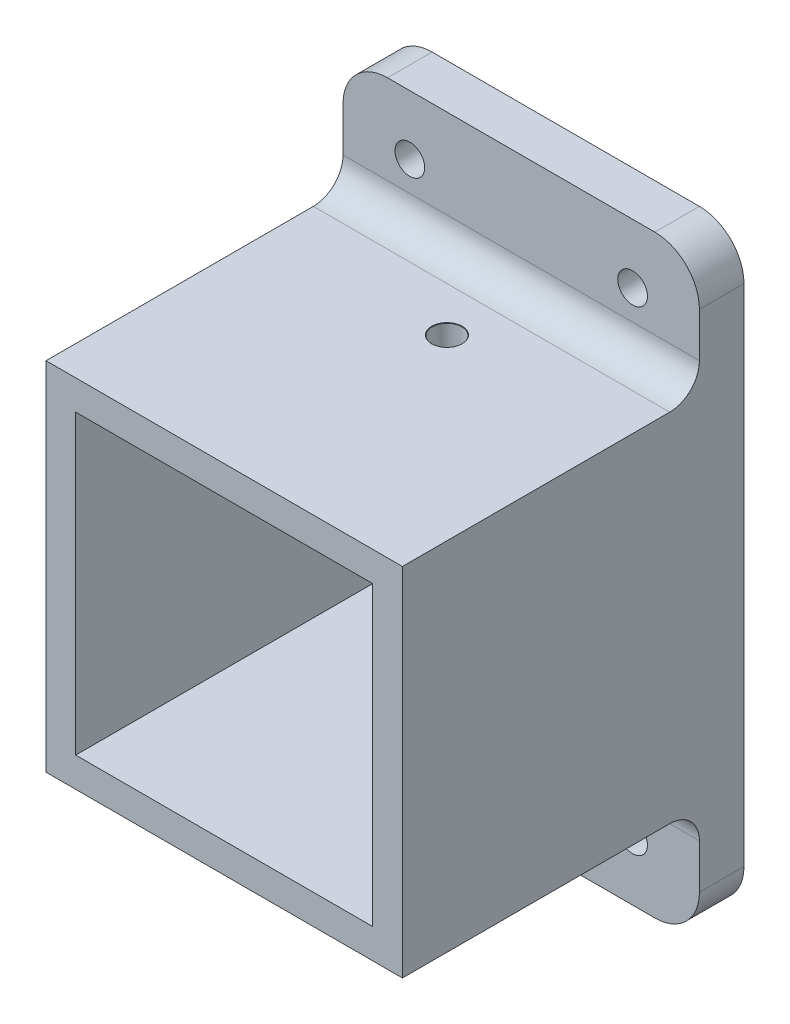
ISO-10303-21;
HEADER;
FILE_DESCRIPTION(('STEP AP214'),'2;1');
FILE_NAME('part.step','',(''),(''),'','','');
FILE_SCHEMA(('AUTOMOTIVE_DESIGN { 1 0 10303 214 1 1 1 1 }'));
ENDSEC;
DATA;
#1=APPLICATION_CONTEXT('core data for automotive mechanical design processes');
#2=APPLICATION_PROTOCOL_DEFINITION('international standard','automotive_design',2000,#1);
#3=PRODUCT_CONTEXT('',#1,'mechanical');
#4=PRODUCT('Part','Part','',(#3));
#5=PRODUCT_RELATED_PRODUCT_CATEGORY('part','',(#4));
#6=PRODUCT_DEFINITION_FORMATION('','',#4);
#7=PRODUCT_DEFINITION_CONTEXT('part definition',#1,'design');
#8=PRODUCT_DEFINITION('design','',#6,#7);
#9=PRODUCT_DEFINITION_SHAPE('','',#8);
#10=(LENGTH_UNIT() NAMED_UNIT(*) SI_UNIT(.MILLI.,.METRE.));
#11=(NAMED_UNIT(*) PLANE_ANGLE_UNIT() SI_UNIT($,.RADIAN.));
#12=(NAMED_UNIT(*) SI_UNIT($,.STERADIAN.) SOLID_ANGLE_UNIT());
#13=UNCERTAINTY_MEASURE_WITH_UNIT(LENGTH_MEASURE(1.E-05),#10,'distance_accuracy_value','');
#14=(GEOMETRIC_REPRESENTATION_CONTEXT(3) GLOBAL_UNCERTAINTY_ASSIGNED_CONTEXT((#13)) GLOBAL_UNIT_ASSIGNED_CONTEXT((#10,
#11,#12)) REPRESENTATION_CONTEXT('',''));
#15=CARTESIAN_POINT('',(0.,0.,0.));
#16=DIRECTION('',(0.,0.,1.));
#17=DIRECTION('',(1.,0.,0.));
#18=AXIS2_PLACEMENT_3D('',#15,#16,#17);
#19=CARTESIAN_POINT('',(0.,0.,20.));
#20=DIRECTION('',(0.,0.,1.));
#21=DIRECTION('',(1.,0.,0.));
#22=AXIS2_PLACEMENT_3D('',#19,#20,#21);
#23=PLANE('',#22);
#24=DIRECTION('',(1.,0.,0.));
#25=VECTOR('',#24,1.);
#26=CARTESIAN_POINT('',(-12.,-12.,20.));
#27=LINE('',#26,#25);
#28=CARTESIAN_POINT('',(-12.,-12.,20.));
#29=VERTEX_POINT('',#28);
#30=CARTESIAN_POINT('',(12.,-12.,20.));
#31=VERTEX_POINT('',#30);
#32=EDGE_CURVE('E204',#29,#31,#27,.T.);
#33=ORIENTED_EDGE('',*,*,#32,.T.);
#34=DIRECTION('',(0.,1.,0.));
#35=VECTOR('',#34,1.);
#36=CARTESIAN_POINT('',(12.,-12.,20.));
#37=LINE('',#36,#35);
#38=CARTESIAN_POINT('',(12.,12.,20.));
#39=VERTEX_POINT('',#38);
#40=EDGE_CURVE('E207',#31,#39,#37,.T.);
#41=ORIENTED_EDGE('',*,*,#40,.T.);
#42=DIRECTION('',(-1.,0.,0.));
#43=VECTOR('',#42,1.);
#44=CARTESIAN_POINT('',(-12.,12.,20.));
#45=LINE('',#44,#43);
#46=CARTESIAN_POINT('',(-12.,12.,20.));
#47=VERTEX_POINT('',#46);
#48=EDGE_CURVE('E206',#39,#47,#45,.T.);
#49=ORIENTED_EDGE('',*,*,#48,.T.);
#50=DIRECTION('',(0.,-1.,0.));
#51=VECTOR('',#50,1.);
#52=CARTESIAN_POINT('',(-12.,-12.,20.));
#53=LINE('',#52,#51);
#54=EDGE_CURVE('E208',#47,#29,#53,.T.);
#55=ORIENTED_EDGE('',*,*,#54,.T.);
#56=EDGE_LOOP('',(#33,#41,#49,#55));
#57=FACE_BOUND('',#56,.T.);
#58=DIRECTION('',(0.,1.,0.));
#59=VECTOR('',#58,1.);
#60=CARTESIAN_POINT('',(10.,-10.,20.));
#61=LINE('',#60,#59);
#62=CARTESIAN_POINT('',(10.,-10.,20.));
#63=VERTEX_POINT('',#62);
#64=CARTESIAN_POINT('',(10.,10.,20.));
#65=VERTEX_POINT('',#64);
#66=EDGE_CURVE('E191',#63,#65,#61,.T.);
#67=ORIENTED_EDGE('',*,*,#66,.F.);
#68=DIRECTION('',(1.,0.,0.));
#69=VECTOR('',#68,1.);
#70=CARTESIAN_POINT('',(-10.,-10.,20.));
#71=LINE('',#70,#69);
#72=CARTESIAN_POINT('',(-10.,-10.,20.));
#73=VERTEX_POINT('',#72);
#74=EDGE_CURVE('E195',#73,#63,#71,.T.);
#75=ORIENTED_EDGE('',*,*,#74,.F.);
#76=DIRECTION('',(0.,-1.,0.));
#77=VECTOR('',#76,1.);
#78=CARTESIAN_POINT('',(-10.,-10.,20.));
#79=LINE('',#78,#77);
#80=CARTESIAN_POINT('',(-10.,10.,20.));
#81=VERTEX_POINT('',#80);
#82=EDGE_CURVE('E173',#81,#73,#79,.T.);
#83=ORIENTED_EDGE('',*,*,#82,.F.);
#84=DIRECTION('',(-1.,0.,0.));
#85=VECTOR('',#84,1.);
#86=CARTESIAN_POINT('',(-10.,10.,20.));
#87=LINE('',#86,#85);
#88=EDGE_CURVE('E332',#65,#81,#87,.T.);
#89=ORIENTED_EDGE('',*,*,#88,.F.);
#90=EDGE_LOOP('',(#67,#75,#83,#89));
#91=FACE_BOUND('',#90,.T.);
#92=ADVANCED_FACE('F41',(#57,#91),#23,.T.);
#93=CARTESIAN_POINT('',(-12.,-12.,20.));
#94=DIRECTION('',(0.,1.,0.));
#95=DIRECTION('',(0.,0.,1.));
#96=AXIS2_PLACEMENT_3D('',#93,#94,#95);
#97=PLANE('',#96);
#98=CARTESIAN_POINT('',(0.,-12.,5.));
#99=DIRECTION('',(0.,1.,0.));
#100=DIRECTION('',(0.,0.,1.));
#101=AXIS2_PLACEMENT_3D('',#98,#99,#100);
#102=CIRCLE('',#101,0.999999999999991);
#103=CARTESIAN_POINT('',(0.,-12.,5.99999999999999));
#104=VERTEX_POINT('',#103);
#105=EDGE_CURVE('E250',#104,#104,#102,.T.);
#106=ORIENTED_EDGE('',*,*,#105,.T.);
#107=EDGE_LOOP('',(#106));
#108=FACE_BOUND('',#107,.T.);
#109=DIRECTION('',(0.,0.,-1.));
#110=VECTOR('',#109,1.);
#111=CARTESIAN_POINT('',(-12.,-12.,20.));
#112=LINE('',#111,#110);
#113=CARTESIAN_POINT('',(-12.,-12.,2.));
#114=VERTEX_POINT('',#113);
#115=EDGE_CURVE('E215',#29,#114,#112,.T.);
#116=ORIENTED_EDGE('',*,*,#115,.T.);
#117=DIRECTION('',(1.,0.,0.));
#118=VECTOR('',#117,1.);
#119=CARTESIAN_POINT('',(12.,-12.,2.));
#120=LINE('',#119,#118);
#121=CARTESIAN_POINT('',(12.,-12.,2.));
#122=VERTEX_POINT('',#121);
#123=EDGE_CURVE('E290',#114,#122,#120,.T.);
#124=ORIENTED_EDGE('',*,*,#123,.T.);
#125=DIRECTION('',(0.,0.,-1.));
#126=VECTOR('',#125,1.);
#127=CARTESIAN_POINT('',(12.,-12.,20.));
#128=LINE('',#127,#126);
#129=EDGE_CURVE('E221',#31,#122,#128,.T.);
#130=ORIENTED_EDGE('',*,*,#129,.F.);
#131=ORIENTED_EDGE('',*,*,#32,.F.);
#132=EDGE_LOOP('',(#116,#124,#130,#131));
#133=FACE_BOUND('',#132,.T.);
#134=ADVANCED_FACE('F341',(#108,#133),#97,.F.);
#135=CARTESIAN_POINT('',(12.,-12.,20.));
#136=DIRECTION('',(-1.,0.,0.));
#137=DIRECTION('',(0.,-1.,0.));
#138=AXIS2_PLACEMENT_3D('',#135,#136,#137);
#139=PLANE('',#138);
#140=DIRECTION('',(0.,1.,0.));
#141=VECTOR('',#140,1.);
#142=CARTESIAN_POINT('',(12.,0.,0.));
#143=LINE('',#142,#141);
#144=CARTESIAN_POINT('',(12.,-17.,0.));
#145=VERTEX_POINT('',#144);
#146=CARTESIAN_POINT('',(12.,-14.,0.));
#147=VERTEX_POINT('',#146);
#148=EDGE_CURVE('E329',#145,#147,#143,.T.);
#149=ORIENTED_EDGE('',*,*,#148,.F.);
#150=DIRECTION('',(0.,0.,1.));
#151=VECTOR('',#150,1.);
#152=CARTESIAN_POINT('',(12.,-17.,20.));
#153=LINE('',#152,#151);
#154=CARTESIAN_POINT('',(12.,-17.,-3.));
#155=VERTEX_POINT('',#154);
#156=EDGE_CURVE('E271',#145,#155,#153,.F.);
#157=ORIENTED_EDGE('',*,*,#156,.T.);
#158=DIRECTION('',(0.,1.,0.));
#159=VECTOR('',#158,1.);
#160=CARTESIAN_POINT('',(12.,0.,-3.));
#161=LINE('',#160,#159);
#162=CARTESIAN_POINT('',(12.,17.,-3.));
#163=VERTEX_POINT('',#162);
#164=EDGE_CURVE('E190',#155,#163,#161,.T.);
#165=ORIENTED_EDGE('',*,*,#164,.T.);
#166=DIRECTION('',(0.,0.,1.));
#167=VECTOR('',#166,1.);
#168=CARTESIAN_POINT('',(12.,17.,0.));
#169=LINE('',#168,#167);
#170=CARTESIAN_POINT('',(12.,17.,0.));
#171=VERTEX_POINT('',#170);
#172=EDGE_CURVE('E270',#163,#171,#169,.T.);
#173=ORIENTED_EDGE('',*,*,#172,.T.);
#174=CARTESIAN_POINT('',(12.,14.,0.));
#175=VERTEX_POINT('',#174);
#176=EDGE_CURVE('E305',#175,#171,#143,.T.);
#177=ORIENTED_EDGE('',*,*,#176,.F.);
#178=CARTESIAN_POINT('',(12.,14.,2.));
#179=DIRECTION('',(-1.,0.,0.));
#180=DIRECTION('',(0.,-1.,0.));
#181=AXIS2_PLACEMENT_3D('',#178,#179,#180);
#182=CIRCLE('',#181,2.);
#183=CARTESIAN_POINT('',(12.,12.,2.));
#184=VERTEX_POINT('',#183);
#185=EDGE_CURVE('E298',#175,#184,#182,.T.);
#186=ORIENTED_EDGE('',*,*,#185,.T.);
#187=DIRECTION('',(0.,0.,-1.));
#188=VECTOR('',#187,1.);
#189=CARTESIAN_POINT('',(12.,12.,20.));
#190=LINE('',#189,#188);
#191=EDGE_CURVE('E219',#39,#184,#190,.T.);
#192=ORIENTED_EDGE('',*,*,#191,.F.);
#193=ORIENTED_EDGE('',*,*,#40,.F.);
#194=ORIENTED_EDGE('',*,*,#129,.T.);
#195=CARTESIAN_POINT('',(12.,-14.,2.));
#196=DIRECTION('',(-1.,0.,0.));
#197=DIRECTION('',(0.,-1.,0.));
#198=AXIS2_PLACEMENT_3D('',#195,#196,#197);
#199=CIRCLE('',#198,2.);
#200=EDGE_CURVE('E47',#122,#147,#199,.T.);
#201=ORIENTED_EDGE('',*,*,#200,.T.);
#202=EDGE_LOOP('',(#149,#157,#165,#173,#177,#186,#192,#193,#194,#201));
#203=FACE_BOUND('',#202,.T.);
#204=ADVANCED_FACE('F297',(#203),#139,.F.);
#205=CARTESIAN_POINT('',(-12.,12.,20.));
#206=DIRECTION('',(0.,-1.,0.));
#207=DIRECTION('',(0.,0.,-1.));
#208=AXIS2_PLACEMENT_3D('',#205,#206,#207);
#209=PLANE('',#208);
#210=CARTESIAN_POINT('',(0.,12.,5.));
#211=DIRECTION('',(0.,1.,0.));
#212=DIRECTION('',(0.,0.,1.));
#213=AXIS2_PLACEMENT_3D('',#210,#211,#212);
#214=CIRCLE('',#213,1.025);
#215=CARTESIAN_POINT('',(0.,12.,6.025));
#216=VERTEX_POINT('',#215);
#217=EDGE_CURVE('E527',#216,#216,#214,.T.);
#218=ORIENTED_EDGE('',*,*,#217,.F.);
#219=EDGE_LOOP('',(#218));
#220=FACE_BOUND('',#219,.T.);
#221=ORIENTED_EDGE('',*,*,#191,.T.);
#222=DIRECTION('',(-1.,0.,0.));
#223=VECTOR('',#222,1.);
#224=CARTESIAN_POINT('',(-12.,12.,2.));
#225=LINE('',#224,#223);
#226=CARTESIAN_POINT('',(-12.,12.,2.));
#227=VERTEX_POINT('',#226);
#228=EDGE_CURVE('E285',#184,#227,#225,.T.);
#229=ORIENTED_EDGE('',*,*,#228,.T.);
#230=DIRECTION('',(0.,0.,-1.));
#231=VECTOR('',#230,1.);
#232=CARTESIAN_POINT('',(-12.,12.,20.));
#233=LINE('',#232,#231);
#234=EDGE_CURVE('E213',#47,#227,#233,.T.);
#235=ORIENTED_EDGE('',*,*,#234,.F.);
#236=ORIENTED_EDGE('',*,*,#48,.F.);
#237=EDGE_LOOP('',(#221,#229,#235,#236));
#238=FACE_BOUND('',#237,.T.);
#239=ADVANCED_FACE('F310',(#220,#238),#209,.F.);
#240=CARTESIAN_POINT('',(-12.,-12.,20.));
#241=DIRECTION('',(1.,0.,0.));
#242=DIRECTION('',(0.,1.,0.));
#243=AXIS2_PLACEMENT_3D('',#240,#241,#242);
#244=PLANE('',#243);
#245=DIRECTION('',(0.,1.,0.));
#246=VECTOR('',#245,1.);
#247=CARTESIAN_POINT('',(-12.,0.,-3.));
#248=LINE('',#247,#246);
#249=CARTESIAN_POINT('',(-12.,-17.,-3.));
#250=VERTEX_POINT('',#249);
#251=CARTESIAN_POINT('',(-12.,17.,-3.));
#252=VERTEX_POINT('',#251);
#253=EDGE_CURVE('E407',#250,#252,#248,.T.);
#254=ORIENTED_EDGE('',*,*,#253,.F.);
#255=DIRECTION('',(0.,0.,1.));
#256=VECTOR('',#255,1.);
#257=CARTESIAN_POINT('',(-12.,-17.,20.));
#258=LINE('',#257,#256);
#259=CARTESIAN_POINT('',(-12.,-17.,0.));
#260=VERTEX_POINT('',#259);
#261=EDGE_CURVE('E249',#250,#260,#258,.T.);
#262=ORIENTED_EDGE('',*,*,#261,.T.);
#263=DIRECTION('',(0.,1.,0.));
#264=VECTOR('',#263,1.);
#265=CARTESIAN_POINT('',(-12.,0.,0.));
#266=LINE('',#265,#264);
#267=CARTESIAN_POINT('',(-12.,-14.,0.));
#268=VERTEX_POINT('',#267);
#269=EDGE_CURVE('E318',#260,#268,#266,.T.);
#270=ORIENTED_EDGE('',*,*,#269,.T.);
#271=CARTESIAN_POINT('',(-12.,-14.,2.));
#272=DIRECTION('',(1.,0.,0.));
#273=DIRECTION('',(0.,1.,0.));
#274=AXIS2_PLACEMENT_3D('',#271,#272,#273);
#275=CIRCLE('',#274,2.);
#276=EDGE_CURVE('E11',#268,#114,#275,.T.);
#277=ORIENTED_EDGE('',*,*,#276,.T.);
#278=ORIENTED_EDGE('',*,*,#115,.F.);
#279=ORIENTED_EDGE('',*,*,#54,.F.);
#280=ORIENTED_EDGE('',*,*,#234,.T.);
#281=CARTESIAN_POINT('',(-12.,14.,2.));
#282=DIRECTION('',(1.,0.,0.));
#283=DIRECTION('',(0.,1.,0.));
#284=AXIS2_PLACEMENT_3D('',#281,#282,#283);
#285=CIRCLE('',#284,2.);
#286=CARTESIAN_POINT('',(-12.,14.,0.));
#287=VERTEX_POINT('',#286);
#288=EDGE_CURVE('E295',#227,#287,#285,.T.);
#289=ORIENTED_EDGE('',*,*,#288,.T.);
#290=CARTESIAN_POINT('',(-12.,17.,0.));
#291=VERTEX_POINT('',#290);
#292=EDGE_CURVE('E313',#287,#291,#266,.T.);
#293=ORIENTED_EDGE('',*,*,#292,.T.);
#294=DIRECTION('',(0.,0.,1.));
#295=VECTOR('',#294,1.);
#296=CARTESIAN_POINT('',(-12.,17.,-3.));
#297=LINE('',#296,#295);
#298=EDGE_CURVE('E224',#291,#252,#297,.F.);
#299=ORIENTED_EDGE('',*,*,#298,.T.);
#300=EDGE_LOOP('',(#254,#262,#270,#277,#278,#279,#280,#289,#293,#299));
#301=FACE_BOUND('',#300,.T.);
#302=ADVANCED_FACE('F312',(#301),#244,.F.);
#303=CARTESIAN_POINT('',(-10.,-10.,20.));
#304=DIRECTION('',(0.,1.,0.));
#305=DIRECTION('',(-1.,0.,0.));
#306=AXIS2_PLACEMENT_3D('',#303,#304,#305);
#307=PLANE('',#306);
#308=CARTESIAN_POINT('',(0.,-10.,5.));
#309=DIRECTION('',(0.,1.,0.));
#310=DIRECTION('',(-1.,0.,0.));
#311=AXIS2_PLACEMENT_3D('',#308,#309,#310);
#312=CIRCLE('',#311,0.999999999999991);
#313=CARTESIAN_POINT('',(-0.999999999999991,-10.,5.));
#314=VERTEX_POINT('',#313);
#315=EDGE_CURVE('E452',#314,#314,#312,.T.);
#316=ORIENTED_EDGE('',*,*,#315,.F.);
#317=EDGE_LOOP('',(#316));
#318=FACE_BOUND('',#317,.T.);
#319=DIRECTION('',(1.,0.,0.));
#320=VECTOR('',#319,1.);
#321=CARTESIAN_POINT('',(-10.,-10.,0.));
#322=LINE('',#321,#320);
#323=CARTESIAN_POINT('',(-10.,-10.,0.));
#324=VERTEX_POINT('',#323);
#325=CARTESIAN_POINT('',(10.,-10.,0.));
#326=VERTEX_POINT('',#325);
#327=EDGE_CURVE('E179',#324,#326,#322,.T.);
#328=ORIENTED_EDGE('',*,*,#327,.F.);
#329=DIRECTION('',(0.,0.,-1.));
#330=VECTOR('',#329,1.);
#331=CARTESIAN_POINT('',(-10.,-10.,20.));
#332=LINE('',#331,#330);
#333=EDGE_CURVE('E168',#73,#324,#332,.T.);
#334=ORIENTED_EDGE('',*,*,#333,.F.);
#335=ORIENTED_EDGE('',*,*,#74,.T.);
#336=DIRECTION('',(0.,0.,-1.));
#337=VECTOR('',#336,1.);
#338=CARTESIAN_POINT('',(10.,-10.,20.));
#339=LINE('',#338,#337);
#340=EDGE_CURVE('E182',#63,#326,#339,.T.);
#341=ORIENTED_EDGE('',*,*,#340,.T.);
#342=EDGE_LOOP('',(#328,#334,#335,#341));
#343=FACE_BOUND('',#342,.T.);
#344=ADVANCED_FACE('F181',(#318,#343),#307,.T.);
#345=CARTESIAN_POINT('',(10.,-10.,20.));
#346=DIRECTION('',(-1.,0.,0.));
#347=DIRECTION('',(0.,-1.,0.));
#348=AXIS2_PLACEMENT_3D('',#345,#346,#347);
#349=PLANE('',#348);
#350=DIRECTION('',(0.,1.,0.));
#351=VECTOR('',#350,1.);
#352=CARTESIAN_POINT('',(10.,-10.,0.));
#353=LINE('',#352,#351);
#354=CARTESIAN_POINT('',(10.,10.,0.));
#355=VERTEX_POINT('',#354);
#356=EDGE_CURVE('E187',#326,#355,#353,.T.);
#357=ORIENTED_EDGE('',*,*,#356,.F.);
#358=ORIENTED_EDGE('',*,*,#340,.F.);
#359=ORIENTED_EDGE('',*,*,#66,.T.);
#360=DIRECTION('',(0.,0.,-1.));
#361=VECTOR('',#360,1.);
#362=CARTESIAN_POINT('',(10.,10.,20.));
#363=LINE('',#362,#361);
#364=EDGE_CURVE('E200',#65,#355,#363,.T.);
#365=ORIENTED_EDGE('',*,*,#364,.T.);
#366=EDGE_LOOP('',(#357,#358,#359,#365));
#367=FACE_BOUND('',#366,.T.);
#368=ADVANCED_FACE('F337',(#367),#349,.T.);
#369=CARTESIAN_POINT('',(-10.,10.,20.));
#370=DIRECTION('',(0.,-1.,0.));
#371=DIRECTION('',(1.,0.,0.));
#372=AXIS2_PLACEMENT_3D('',#369,#370,#371);
#373=PLANE('',#372);
#374=CARTESIAN_POINT('',(0.,10.,5.));
#375=DIRECTION('',(0.,-1.,0.));
#376=DIRECTION('',(1.,0.,0.));
#377=AXIS2_PLACEMENT_3D('',#374,#375,#376);
#378=CIRCLE('',#377,0.999999999999991);
#379=CARTESIAN_POINT('',(0.999999999999991,10.,5.));
#380=VERTEX_POINT('',#379);
#381=EDGE_CURVE('E242',#380,#380,#378,.T.);
#382=ORIENTED_EDGE('',*,*,#381,.F.);
#383=EDGE_LOOP('',(#382));
#384=FACE_BOUND('',#383,.T.);
#385=DIRECTION('',(-1.,0.,0.));
#386=VECTOR('',#385,1.);
#387=CARTESIAN_POINT('',(-10.,10.,0.));
#388=LINE('',#387,#386);
#389=CARTESIAN_POINT('',(-10.,10.,0.));
#390=VERTEX_POINT('',#389);
#391=EDGE_CURVE('E192',#355,#390,#388,.T.);
#392=ORIENTED_EDGE('',*,*,#391,.F.);
#393=ORIENTED_EDGE('',*,*,#364,.F.);
#394=ORIENTED_EDGE('',*,*,#88,.T.);
#395=DIRECTION('',(0.,0.,-1.));
#396=VECTOR('',#395,1.);
#397=CARTESIAN_POINT('',(-10.,10.,20.));
#398=LINE('',#397,#396);
#399=EDGE_CURVE('E176',#81,#390,#398,.T.);
#400=ORIENTED_EDGE('',*,*,#399,.T.);
#401=EDGE_LOOP('',(#392,#393,#394,#400));
#402=FACE_BOUND('',#401,.T.);
#403=ADVANCED_FACE('F342',(#384,#402),#373,.T.);
#404=CARTESIAN_POINT('',(-10.,-10.,20.));
#405=DIRECTION('',(1.,0.,0.));
#406=DIRECTION('',(0.,0.,-1.));
#407=AXIS2_PLACEMENT_3D('',#404,#405,#406);
#408=PLANE('',#407);
#409=DIRECTION('',(0.,-1.,0.));
#410=VECTOR('',#409,1.);
#411=CARTESIAN_POINT('',(-10.,-10.,0.));
#412=LINE('',#411,#410);
#413=EDGE_CURVE('E167',#390,#324,#412,.T.);
#414=ORIENTED_EDGE('',*,*,#413,.F.);
#415=ORIENTED_EDGE('',*,*,#399,.F.);
#416=ORIENTED_EDGE('',*,*,#82,.T.);
#417=ORIENTED_EDGE('',*,*,#333,.T.);
#418=EDGE_LOOP('',(#414,#415,#416,#417));
#419=FACE_BOUND('',#418,.T.);
#420=ADVANCED_FACE('F166',(#419),#408,.T.);
#421=CARTESIAN_POINT('',(0.,0.,0.));
#422=DIRECTION('',(0.,0.,-1.));
#423=DIRECTION('',(-1.,0.,0.));
#424=AXIS2_PLACEMENT_3D('',#421,#422,#423);
#425=PLANE('',#424);
#426=ORIENTED_EDGE('',*,*,#413,.T.);
#427=ORIENTED_EDGE('',*,*,#327,.T.);
#428=ORIENTED_EDGE('',*,*,#356,.T.);
#429=ORIENTED_EDGE('',*,*,#391,.T.);
#430=EDGE_LOOP('',(#426,#427,#428,#429));
#431=FACE_BOUND('',#430,.T.);
#432=ADVANCED_FACE('F186',(#431),#425,.F.);
#433=CARTESIAN_POINT('',(-7.5,-16.,0.));
#434=DIRECTION('',(0.,0.,-1.));
#435=DIRECTION('',(-1.,0.,0.));
#436=AXIS2_PLACEMENT_3D('',#433,#434,#435);
#437=CIRCLE('',#436,0.999999999999997);
#438=CARTESIAN_POINT('',(-8.49999999999999,-16.,0.));
#439=VERTEX_POINT('',#438);
#440=EDGE_CURVE('E237',#439,#439,#437,.T.);
#441=ORIENTED_EDGE('',*,*,#440,.T.);
#442=EDGE_LOOP('',(#441));
#443=FACE_BOUND('',#442,.T.);
#444=CARTESIAN_POINT('',(7.5,-16.,0.));
#445=DIRECTION('',(0.,0.,-1.));
#446=DIRECTION('',(-1.,0.,0.));
#447=AXIS2_PLACEMENT_3D('',#444,#445,#446);
#448=CIRCLE('',#447,0.999999999999997);
#449=CARTESIAN_POINT('',(6.5,-16.,0.));
#450=VERTEX_POINT('',#449);
#451=EDGE_CURVE('E234',#450,#450,#448,.T.);
#452=ORIENTED_EDGE('',*,*,#451,.T.);
#453=EDGE_LOOP('',(#452));
#454=FACE_BOUND('',#453,.T.);
#455=ORIENTED_EDGE('',*,*,#148,.T.);
#456=DIRECTION('',(1.,0.,0.));
#457=VECTOR('',#456,1.);
#458=CARTESIAN_POINT('',(-12.,-14.,0.));
#459=LINE('',#458,#457);
#460=EDGE_CURVE('E65',#147,#268,#459,.F.);
#461=ORIENTED_EDGE('',*,*,#460,.T.);
#462=ORIENTED_EDGE('',*,*,#269,.F.);
#463=CARTESIAN_POINT('',(-9.,-17.,0.));
#464=DIRECTION('',(0.,0.,-1.));
#465=DIRECTION('',(-1.,0.,0.));
#466=AXIS2_PLACEMENT_3D('',#463,#464,#465);
#467=CIRCLE('',#466,3.);
#468=CARTESIAN_POINT('',(-9.,-20.,0.));
#469=VERTEX_POINT('',#468);
#470=EDGE_CURVE('E253',#260,#469,#467,.F.);
#471=ORIENTED_EDGE('',*,*,#470,.T.);
#472=DIRECTION('',(-1.,0.,0.));
#473=VECTOR('',#472,1.);
#474=CARTESIAN_POINT('',(0.,-20.,0.));
#475=LINE('',#474,#473);
#476=CARTESIAN_POINT('',(9.,-20.,0.));
#477=VERTEX_POINT('',#476);
#478=EDGE_CURVE('E227',#477,#469,#475,.T.);
#479=ORIENTED_EDGE('',*,*,#478,.F.);
#480=CARTESIAN_POINT('',(9.,-17.,0.));
#481=DIRECTION('',(0.,0.,-1.));
#482=DIRECTION('',(-1.,0.,0.));
#483=AXIS2_PLACEMENT_3D('',#480,#481,#482);
#484=CIRCLE('',#483,3.);
#485=EDGE_CURVE('E254',#477,#145,#484,.F.);
#486=ORIENTED_EDGE('',*,*,#485,.T.);
#487=EDGE_LOOP('',(#455,#461,#462,#471,#479,#486));
#488=FACE_BOUND('',#487,.T.);
#489=ADVANCED_FACE('F393',(#443,#454,#488),#425,.F.);
#490=CARTESIAN_POINT('',(0.,-20.,-3.));
#491=DIRECTION('',(0.,1.,0.));
#492=DIRECTION('',(-1.,0.,0.));
#493=AXIS2_PLACEMENT_3D('',#490,#491,#492);
#494=PLANE('',#493);
#495=ORIENTED_EDGE('',*,*,#478,.T.);
#496=DIRECTION('',(0.,0.,1.));
#497=VECTOR('',#496,1.);
#498=CARTESIAN_POINT('',(-9.,-20.,-3.));
#499=LINE('',#498,#497);
#500=CARTESIAN_POINT('',(-9.,-20.,-3.));
#501=VERTEX_POINT('',#500);
#502=EDGE_CURVE('E258',#469,#501,#499,.F.);
#503=ORIENTED_EDGE('',*,*,#502,.T.);
#504=DIRECTION('',(-1.,0.,0.));
#505=VECTOR('',#504,1.);
#506=CARTESIAN_POINT('',(0.,-20.,-3.));
#507=LINE('',#506,#505);
#508=CARTESIAN_POINT('',(9.,-20.,-3.));
#509=VERTEX_POINT('',#508);
#510=EDGE_CURVE('E328',#509,#501,#507,.T.);
#511=ORIENTED_EDGE('',*,*,#510,.F.);
#512=DIRECTION('',(0.,0.,1.));
#513=VECTOR('',#512,1.);
#514=CARTESIAN_POINT('',(9.,-20.,-3.));
#515=LINE('',#514,#513);
#516=EDGE_CURVE('E260',#509,#477,#515,.T.);
#517=ORIENTED_EDGE('',*,*,#516,.T.);
#518=EDGE_LOOP('',(#495,#503,#511,#517));
#519=FACE_BOUND('',#518,.T.);
#520=ADVANCED_FACE('F399',(#519),#494,.F.);
#521=CARTESIAN_POINT('',(0.,20.,-3.));
#522=DIRECTION('',(0.,1.,0.));
#523=DIRECTION('',(-1.,0.,0.));
#524=AXIS2_PLACEMENT_3D('',#521,#522,#523);
#525=PLANE('',#524);
#526=DIRECTION('',(-1.,0.,0.));
#527=VECTOR('',#526,1.);
#528=CARTESIAN_POINT('',(0.,20.,-3.));
#529=LINE('',#528,#527);
#530=CARTESIAN_POINT('',(9.00000000000001,20.,-3.));
#531=VERTEX_POINT('',#530);
#532=CARTESIAN_POINT('',(-9.00000000000001,20.,-3.));
#533=VERTEX_POINT('',#532);
#534=EDGE_CURVE('E409',#531,#533,#529,.T.);
#535=ORIENTED_EDGE('',*,*,#534,.T.);
#536=DIRECTION('',(0.,0.,1.));
#537=VECTOR('',#536,1.);
#538=CARTESIAN_POINT('',(-9.00000000000001,20.,0.));
#539=LINE('',#538,#537);
#540=CARTESIAN_POINT('',(-9.00000000000001,20.,0.));
#541=VERTEX_POINT('',#540);
#542=EDGE_CURVE('E280',#533,#541,#539,.T.);
#543=ORIENTED_EDGE('',*,*,#542,.T.);
#544=DIRECTION('',(-1.,0.,0.));
#545=VECTOR('',#544,1.);
#546=CARTESIAN_POINT('',(0.,20.,0.));
#547=LINE('',#546,#545);
#548=CARTESIAN_POINT('',(9.00000000000001,20.,0.));
#549=VERTEX_POINT('',#548);
#550=EDGE_CURVE('E325',#549,#541,#547,.T.);
#551=ORIENTED_EDGE('',*,*,#550,.F.);
#552=DIRECTION('',(0.,0.,1.));
#553=VECTOR('',#552,1.);
#554=CARTESIAN_POINT('',(9.00000000000001,20.,-3.));
#555=LINE('',#554,#553);
#556=EDGE_CURVE('E273',#549,#531,#555,.F.);
#557=ORIENTED_EDGE('',*,*,#556,.T.);
#558=EDGE_LOOP('',(#535,#543,#551,#557));
#559=FACE_BOUND('',#558,.T.);
#560=ADVANCED_FACE('F425',(#559),#525,.T.);
#561=CARTESIAN_POINT('',(0.,0.,-3.));
#562=DIRECTION('',(0.,0.,-1.));
#563=DIRECTION('',(-1.,0.,0.));
#564=AXIS2_PLACEMENT_3D('',#561,#562,#563);
#565=PLANE('',#564);
#566=CARTESIAN_POINT('',(-7.5,-16.,-3.));
#567=DIRECTION('',(0.,0.,-1.));
#568=DIRECTION('',(-1.,0.,0.));
#569=AXIS2_PLACEMENT_3D('',#566,#567,#568);
#570=CIRCLE('',#569,1.025);
#571=CARTESIAN_POINT('',(-8.525,-16.,-3.));
#572=VERTEX_POINT('',#571);
#573=EDGE_CURVE('E454',#572,#572,#570,.T.);
#574=ORIENTED_EDGE('',*,*,#573,.F.);
#575=EDGE_LOOP('',(#574));
#576=FACE_BOUND('',#575,.T.);
#577=CARTESIAN_POINT('',(7.5,-16.,-3.));
#578=DIRECTION('',(0.,0.,-1.));
#579=DIRECTION('',(-1.,0.,0.));
#580=AXIS2_PLACEMENT_3D('',#577,#578,#579);
#581=CIRCLE('',#580,1.025);
#582=CARTESIAN_POINT('',(6.475,-16.,-3.));
#583=VERTEX_POINT('',#582);
#584=EDGE_CURVE('E245',#583,#583,#581,.T.);
#585=ORIENTED_EDGE('',*,*,#584,.F.);
#586=EDGE_LOOP('',(#585));
#587=FACE_BOUND('',#586,.T.);
#588=CARTESIAN_POINT('',(-7.5,16.,-3.));
#589=DIRECTION('',(0.,0.,-1.));
#590=DIRECTION('',(-1.,0.,0.));
#591=AXIS2_PLACEMENT_3D('',#588,#589,#590);
#592=CIRCLE('',#591,1.025);
#593=CARTESIAN_POINT('',(-8.525,16.,-3.));
#594=VERTEX_POINT('',#593);
#595=EDGE_CURVE('E240',#594,#594,#592,.T.);
#596=ORIENTED_EDGE('',*,*,#595,.F.);
#597=EDGE_LOOP('',(#596));
#598=FACE_BOUND('',#597,.T.);
#599=CARTESIAN_POINT('',(7.5,16.,-3.));
#600=DIRECTION('',(0.,0.,-1.));
#601=DIRECTION('',(-1.,0.,0.));
#602=AXIS2_PLACEMENT_3D('',#599,#600,#601);
#603=CIRCLE('',#602,1.025);
#604=CARTESIAN_POINT('',(6.475,16.,-3.));
#605=VERTEX_POINT('',#604);
#606=EDGE_CURVE('E235',#605,#605,#603,.T.);
#607=ORIENTED_EDGE('',*,*,#606,.F.);
#608=EDGE_LOOP('',(#607));
#609=FACE_BOUND('',#608,.T.);
#610=ORIENTED_EDGE('',*,*,#510,.T.);
#611=CARTESIAN_POINT('',(-9.,-17.,-3.));
#612=DIRECTION('',(0.,0.,-1.));
#613=DIRECTION('',(-1.,0.,0.));
#614=AXIS2_PLACEMENT_3D('',#611,#612,#613);
#615=CIRCLE('',#614,3.);
#616=EDGE_CURVE('E269',#501,#250,#615,.T.);
#617=ORIENTED_EDGE('',*,*,#616,.T.);
#618=ORIENTED_EDGE('',*,*,#253,.T.);
#619=CARTESIAN_POINT('',(-9.00000000000001,17.,-3.));
#620=DIRECTION('',(0.,0.,-1.));
#621=DIRECTION('',(-1.,0.,0.));
#622=AXIS2_PLACEMENT_3D('',#619,#620,#621);
#623=CIRCLE('',#622,3.);
#624=EDGE_CURVE('E263',#252,#533,#623,.T.);
#625=ORIENTED_EDGE('',*,*,#624,.T.);
#626=ORIENTED_EDGE('',*,*,#534,.F.);
#627=CARTESIAN_POINT('',(9.00000000000001,17.,-3.));
#628=DIRECTION('',(0.,0.,-1.));
#629=DIRECTION('',(-1.,0.,0.));
#630=AXIS2_PLACEMENT_3D('',#627,#628,#629);
#631=CIRCLE('',#630,3.);
#632=EDGE_CURVE('E262',#531,#163,#631,.T.);
#633=ORIENTED_EDGE('',*,*,#632,.T.);
#634=ORIENTED_EDGE('',*,*,#164,.F.);
#635=CARTESIAN_POINT('',(9.,-17.,-3.));
#636=DIRECTION('',(0.,0.,-1.));
#637=DIRECTION('',(-1.,0.,0.));
#638=AXIS2_PLACEMENT_3D('',#635,#636,#637);
#639=CIRCLE('',#638,3.);
#640=EDGE_CURVE('E266',#155,#509,#639,.T.);
#641=ORIENTED_EDGE('',*,*,#640,.T.);
#642=EDGE_LOOP('',(#610,#617,#618,#625,#626,#633,#634,#641));
#643=FACE_BOUND('',#642,.T.);
#644=ADVANCED_FACE('F403',(#576,#587,#598,#609,#643),#565,.T.);
#645=CARTESIAN_POINT('',(-7.5,16.,0.));
#646=DIRECTION('',(0.,0.,-1.));
#647=DIRECTION('',(-1.,0.,0.));
#648=AXIS2_PLACEMENT_3D('',#645,#646,#647);
#649=CIRCLE('',#648,0.999999999999997);
#650=CARTESIAN_POINT('',(-8.49999999999999,16.,0.));
#651=VERTEX_POINT('',#650);
#652=EDGE_CURVE('E230',#651,#651,#649,.T.);
#653=ORIENTED_EDGE('',*,*,#652,.T.);
#654=EDGE_LOOP('',(#653));
#655=FACE_BOUND('',#654,.T.);
#656=CARTESIAN_POINT('',(7.5,16.,0.));
#657=DIRECTION('',(0.,0.,-1.));
#658=DIRECTION('',(-1.,0.,0.));
#659=AXIS2_PLACEMENT_3D('',#656,#657,#658);
#660=CIRCLE('',#659,0.999999999999997);
#661=CARTESIAN_POINT('',(6.5,16.,0.));
#662=VERTEX_POINT('',#661);
#663=EDGE_CURVE('E223',#662,#662,#660,.T.);
#664=ORIENTED_EDGE('',*,*,#663,.T.);
#665=EDGE_LOOP('',(#664));
#666=FACE_BOUND('',#665,.T.);
#667=ORIENTED_EDGE('',*,*,#292,.F.);
#668=DIRECTION('',(-1.,0.,0.));
#669=VECTOR('',#668,1.);
#670=CARTESIAN_POINT('',(12.,14.,0.));
#671=LINE('',#670,#669);
#672=EDGE_CURVE('E289',#287,#175,#671,.F.);
#673=ORIENTED_EDGE('',*,*,#672,.T.);
#674=ORIENTED_EDGE('',*,*,#176,.T.);
#675=CARTESIAN_POINT('',(9.00000000000001,17.,0.));
#676=DIRECTION('',(0.,0.,-1.));
#677=DIRECTION('',(-1.,0.,0.));
#678=AXIS2_PLACEMENT_3D('',#675,#676,#677);
#679=CIRCLE('',#678,3.);
#680=EDGE_CURVE('E278',#171,#549,#679,.F.);
#681=ORIENTED_EDGE('',*,*,#680,.T.);
#682=ORIENTED_EDGE('',*,*,#550,.T.);
#683=CARTESIAN_POINT('',(-9.00000000000001,17.,0.));
#684=DIRECTION('',(0.,0.,-1.));
#685=DIRECTION('',(-1.,0.,0.));
#686=AXIS2_PLACEMENT_3D('',#683,#684,#685);
#687=CIRCLE('',#686,3.);
#688=EDGE_CURVE('E282',#541,#291,#687,.F.);
#689=ORIENTED_EDGE('',*,*,#688,.T.);
#690=EDGE_LOOP('',(#667,#673,#674,#681,#682,#689));
#691=FACE_BOUND('',#690,.T.);
#692=ADVANCED_FACE('F320',(#655,#666,#691),#425,.F.);
#693=CARTESIAN_POINT('',(7.5,16.,-3.));
#694=DIRECTION('',(0.,0.,-1.));
#695=DIRECTION('',(-1.,0.,0.));
#696=AXIS2_PLACEMENT_3D('',#693,#694,#695);
#697=CYLINDRICAL_SURFACE('',#696,0.999999999999997);
#698=CARTESIAN_POINT('',(7.5,16.,-2.975));
#699=DIRECTION('',(0.,0.,-1.));
#700=DIRECTION('',(-1.,0.,0.));
#701=AXIS2_PLACEMENT_3D('',#698,#699,#700);
#702=CIRCLE('',#701,1.);
#703=CARTESIAN_POINT('',(6.5,16.,-2.975));
#704=VERTEX_POINT('',#703);
#705=EDGE_CURVE('E226',#704,#704,#702,.T.);
#706=ORIENTED_EDGE('',*,*,#705,.T.);
#707=EDGE_LOOP('',(#706));
#708=FACE_BOUND('',#707,.T.);
#709=ORIENTED_EDGE('',*,*,#663,.F.);
#710=EDGE_LOOP('',(#709));
#711=FACE_BOUND('',#710,.T.);
#712=ADVANCED_FACE('F473',(#708,#711),#697,.F.);
#713=CARTESIAN_POINT('',(7.5,16.,-3.));
#714=DIRECTION('',(0.,0.,-1.));
#715=DIRECTION('',(-1.,0.,0.));
#716=AXIS2_PLACEMENT_3D('',#713,#714,#715);
#717=CONICAL_SURFACE('',#716,1.025,0.785398163397379);
#718=ORIENTED_EDGE('',*,*,#705,.F.);
#719=EDGE_LOOP('',(#718));
#720=FACE_BOUND('',#719,.T.);
#721=ORIENTED_EDGE('',*,*,#606,.T.);
#722=EDGE_LOOP('',(#721));
#723=FACE_BOUND('',#722,.T.);
#724=ADVANCED_FACE('F479',(#720,#723),#717,.F.);
#725=CARTESIAN_POINT('',(-7.5,16.,-3.));
#726=DIRECTION('',(0.,0.,-1.));
#727=DIRECTION('',(-1.,0.,0.));
#728=AXIS2_PLACEMENT_3D('',#725,#726,#727);
#729=CYLINDRICAL_SURFACE('',#728,0.999999999999997);
#730=CARTESIAN_POINT('',(-7.5,16.,-2.975));
#731=DIRECTION('',(0.,0.,-1.));
#732=DIRECTION('',(-1.,0.,0.));
#733=AXIS2_PLACEMENT_3D('',#730,#731,#732);
#734=CIRCLE('',#733,0.999999999999999);
#735=CARTESIAN_POINT('',(-8.49999999999999,16.,-2.975));
#736=VERTEX_POINT('',#735);
#737=EDGE_CURVE('E231',#736,#736,#734,.T.);
#738=ORIENTED_EDGE('',*,*,#737,.T.);
#739=EDGE_LOOP('',(#738));
#740=FACE_BOUND('',#739,.T.);
#741=ORIENTED_EDGE('',*,*,#652,.F.);
#742=EDGE_LOOP('',(#741));
#743=FACE_BOUND('',#742,.T.);
#744=ADVANCED_FACE('F481',(#740,#743),#729,.F.);
#745=CARTESIAN_POINT('',(-7.5,16.,-3.));
#746=DIRECTION('',(0.,0.,-1.));
#747=DIRECTION('',(-1.,0.,0.));
#748=AXIS2_PLACEMENT_3D('',#745,#746,#747);
#749=CONICAL_SURFACE('',#748,1.025,0.785398163397414);
#750=ORIENTED_EDGE('',*,*,#737,.F.);
#751=EDGE_LOOP('',(#750));
#752=FACE_BOUND('',#751,.T.);
#753=ORIENTED_EDGE('',*,*,#595,.T.);
#754=EDGE_LOOP('',(#753));
#755=FACE_BOUND('',#754,.T.);
#756=ADVANCED_FACE('F490',(#752,#755),#749,.F.);
#757=CARTESIAN_POINT('',(7.5,-16.,-3.));
#758=DIRECTION('',(0.,0.,-1.));
#759=DIRECTION('',(-1.,0.,0.));
#760=AXIS2_PLACEMENT_3D('',#757,#758,#759);
#761=CYLINDRICAL_SURFACE('',#760,0.999999999999997);
#762=CARTESIAN_POINT('',(7.5,-16.,-2.975));
#763=DIRECTION('',(0.,0.,-1.));
#764=DIRECTION('',(-1.,0.,0.));
#765=AXIS2_PLACEMENT_3D('',#762,#763,#764);
#766=CIRCLE('',#765,1.);
#767=CARTESIAN_POINT('',(6.5,-16.,-2.975));
#768=VERTEX_POINT('',#767);
#769=EDGE_CURVE('E238',#768,#768,#766,.T.);
#770=ORIENTED_EDGE('',*,*,#769,.T.);
#771=EDGE_LOOP('',(#770));
#772=FACE_BOUND('',#771,.T.);
#773=ORIENTED_EDGE('',*,*,#451,.F.);
#774=EDGE_LOOP('',(#773));
#775=FACE_BOUND('',#774,.T.);
#776=ADVANCED_FACE('F496',(#772,#775),#761,.F.);
#777=CARTESIAN_POINT('',(7.5,-16.,-3.));
#778=DIRECTION('',(0.,0.,-1.));
#779=DIRECTION('',(-1.,0.,0.));
#780=AXIS2_PLACEMENT_3D('',#777,#778,#779);
#781=CONICAL_SURFACE('',#780,1.025,0.785398163397379);
#782=ORIENTED_EDGE('',*,*,#769,.F.);
#783=EDGE_LOOP('',(#782));
#784=FACE_BOUND('',#783,.T.);
#785=ORIENTED_EDGE('',*,*,#584,.T.);
#786=EDGE_LOOP('',(#785));
#787=FACE_BOUND('',#786,.T.);
#788=ADVANCED_FACE('F499',(#784,#787),#781,.F.);
#789=CARTESIAN_POINT('',(-7.5,-16.,-3.));
#790=DIRECTION('',(0.,0.,-1.));
#791=DIRECTION('',(-1.,0.,0.));
#792=AXIS2_PLACEMENT_3D('',#789,#790,#791);
#793=CYLINDRICAL_SURFACE('',#792,0.999999999999997);
#794=CARTESIAN_POINT('',(-7.5,-16.,-2.975));
#795=DIRECTION('',(0.,0.,-1.));
#796=DIRECTION('',(-1.,0.,0.));
#797=AXIS2_PLACEMENT_3D('',#794,#795,#796);
#798=CIRCLE('',#797,0.999999999999999);
#799=CARTESIAN_POINT('',(-8.49999999999999,-16.,-2.975));
#800=VERTEX_POINT('',#799);
#801=EDGE_CURVE('E243',#800,#800,#798,.T.);
#802=ORIENTED_EDGE('',*,*,#801,.T.);
#803=EDGE_LOOP('',(#802));
#804=FACE_BOUND('',#803,.T.);
#805=ORIENTED_EDGE('',*,*,#440,.F.);
#806=EDGE_LOOP('',(#805));
#807=FACE_BOUND('',#806,.T.);
#808=ADVANCED_FACE('F502',(#804,#807),#793,.F.);
#809=CARTESIAN_POINT('',(-7.5,-16.,-3.));
#810=DIRECTION('',(0.,0.,-1.));
#811=DIRECTION('',(-1.,0.,0.));
#812=AXIS2_PLACEMENT_3D('',#809,#810,#811);
#813=CONICAL_SURFACE('',#812,1.025,0.785398163397414);
#814=ORIENTED_EDGE('',*,*,#801,.F.);
#815=EDGE_LOOP('',(#814));
#816=FACE_BOUND('',#815,.T.);
#817=ORIENTED_EDGE('',*,*,#573,.T.);
#818=EDGE_LOOP('',(#817));
#819=FACE_BOUND('',#818,.T.);
#820=ADVANCED_FACE('F507',(#816,#819),#813,.F.);
#821=CARTESIAN_POINT('',(0.,12.,5.));
#822=DIRECTION('',(0.,1.,0.));
#823=DIRECTION('',(0.,0.,1.));
#824=AXIS2_PLACEMENT_3D('',#821,#822,#823);
#825=CYLINDRICAL_SURFACE('',#824,0.999999999999991);
#826=ORIENTED_EDGE('',*,*,#381,.T.);
#827=EDGE_LOOP('',(#826));
#828=FACE_BOUND('',#827,.T.);
#829=CARTESIAN_POINT('',(0.,11.975,5.));
#830=DIRECTION('',(0.,1.,0.));
#831=DIRECTION('',(0.,0.,1.));
#832=AXIS2_PLACEMENT_3D('',#829,#830,#831);
#833=CIRCLE('',#832,0.999999999999987);
#834=CARTESIAN_POINT('',(0.,11.975,5.99999999999999));
#835=VERTEX_POINT('',#834);
#836=EDGE_CURVE('E247',#835,#835,#833,.T.);
#837=ORIENTED_EDGE('',*,*,#836,.T.);
#838=EDGE_LOOP('',(#837));
#839=FACE_BOUND('',#838,.T.);
#840=ADVANCED_FACE('F512',(#828,#839),#825,.F.);
#841=CARTESIAN_POINT('',(0.,12.,5.));
#842=DIRECTION('',(0.,1.,0.));
#843=DIRECTION('',(0.,0.,1.));
#844=AXIS2_PLACEMENT_3D('',#841,#842,#843);
#845=CONICAL_SURFACE('',#844,1.025,0.785398163397726);
#846=ORIENTED_EDGE('',*,*,#836,.F.);
#847=EDGE_LOOP('',(#846));
#848=FACE_BOUND('',#847,.T.);
#849=ORIENTED_EDGE('',*,*,#217,.T.);
#850=EDGE_LOOP('',(#849));
#851=FACE_BOUND('',#850,.T.);
#852=ADVANCED_FACE('F513',(#848,#851),#845,.F.);
#853=ORIENTED_EDGE('',*,*,#315,.T.);
#854=EDGE_LOOP('',(#853));
#855=FACE_BOUND('',#854,.T.);
#856=ORIENTED_EDGE('',*,*,#105,.F.);
#857=EDGE_LOOP('',(#856));
#858=FACE_BOUND('',#857,.T.);
#859=ADVANCED_FACE('F370',(#855,#858),#825,.F.);
#860=CARTESIAN_POINT('',(-9.,-17.,20.));
#861=DIRECTION('',(0.,0.,1.));
#862=DIRECTION('',(1.,0.,0.));
#863=AXIS2_PLACEMENT_3D('',#860,#861,#862);
#864=CYLINDRICAL_SURFACE('',#863,3.);
#865=ORIENTED_EDGE('',*,*,#616,.F.);
#866=ORIENTED_EDGE('',*,*,#502,.F.);
#867=ORIENTED_EDGE('',*,*,#470,.F.);
#868=ORIENTED_EDGE('',*,*,#261,.F.);
#869=EDGE_LOOP('',(#865,#866,#867,#868));
#870=FACE_BOUND('',#869,.T.);
#871=ADVANCED_FACE('F361',(#870),#864,.T.);
#872=CARTESIAN_POINT('',(9.,-17.,-3.));
#873=DIRECTION('',(0.,0.,1.));
#874=DIRECTION('',(1.,0.,0.));
#875=AXIS2_PLACEMENT_3D('',#872,#873,#874);
#876=CYLINDRICAL_SURFACE('',#875,3.);
#877=ORIENTED_EDGE('',*,*,#640,.F.);
#878=ORIENTED_EDGE('',*,*,#156,.F.);
#879=ORIENTED_EDGE('',*,*,#485,.F.);
#880=ORIENTED_EDGE('',*,*,#516,.F.);
#881=EDGE_LOOP('',(#877,#878,#879,#880));
#882=FACE_BOUND('',#881,.T.);
#883=ADVANCED_FACE('F366',(#882),#876,.T.);
#884=CARTESIAN_POINT('',(-9.00000000000001,17.,-3.));
#885=DIRECTION('',(0.,0.,-1.));
#886=DIRECTION('',(-1.,0.,0.));
#887=AXIS2_PLACEMENT_3D('',#884,#885,#886);
#888=CYLINDRICAL_SURFACE('',#887,3.);
#889=ORIENTED_EDGE('',*,*,#624,.F.);
#890=ORIENTED_EDGE('',*,*,#298,.F.);
#891=ORIENTED_EDGE('',*,*,#688,.F.);
#892=ORIENTED_EDGE('',*,*,#542,.F.);
#893=EDGE_LOOP('',(#889,#890,#891,#892));
#894=FACE_BOUND('',#893,.T.);
#895=ADVANCED_FACE('F371',(#894),#888,.T.);
#896=CARTESIAN_POINT('',(9.00000000000001,17.,20.));
#897=DIRECTION('',(0.,0.,-1.));
#898=DIRECTION('',(-1.,0.,0.));
#899=AXIS2_PLACEMENT_3D('',#896,#897,#898);
#900=CYLINDRICAL_SURFACE('',#899,3.);
#901=ORIENTED_EDGE('',*,*,#632,.F.);
#902=ORIENTED_EDGE('',*,*,#556,.F.);
#903=ORIENTED_EDGE('',*,*,#680,.F.);
#904=ORIENTED_EDGE('',*,*,#172,.F.);
#905=EDGE_LOOP('',(#901,#902,#903,#904));
#906=FACE_BOUND('',#905,.T.);
#907=ADVANCED_FACE('F374',(#906),#900,.T.);
#908=CARTESIAN_POINT('',(-12.,14.,2.));
#909=DIRECTION('',(1.,0.,0.));
#910=DIRECTION('',(0.,0.,-1.));
#911=AXIS2_PLACEMENT_3D('',#908,#909,#910);
#912=CYLINDRICAL_SURFACE('',#911,2.);
#913=ORIENTED_EDGE('',*,*,#185,.F.);
#914=ORIENTED_EDGE('',*,*,#672,.F.);
#915=ORIENTED_EDGE('',*,*,#288,.F.);
#916=ORIENTED_EDGE('',*,*,#228,.F.);
#917=EDGE_LOOP('',(#913,#914,#915,#916));
#918=FACE_BOUND('',#917,.T.);
#919=ADVANCED_FACE('F307',(#918),#912,.F.);
#920=CARTESIAN_POINT('',(-12.,-14.,2.));
#921=DIRECTION('',(-1.,0.,0.));
#922=DIRECTION('',(0.,0.,1.));
#923=AXIS2_PLACEMENT_3D('',#920,#921,#922);
#924=CYLINDRICAL_SURFACE('',#923,2.);
#925=ORIENTED_EDGE('',*,*,#276,.F.);
#926=ORIENTED_EDGE('',*,*,#460,.F.);
#927=ORIENTED_EDGE('',*,*,#200,.F.);
#928=ORIENTED_EDGE('',*,*,#123,.F.);
#929=EDGE_LOOP('',(#925,#926,#927,#928));
#930=FACE_BOUND('',#929,.T.);
#931=ADVANCED_FACE('F43',(#930),#924,.F.);
#932=CLOSED_SHELL('',(#92,#134,#204,#239,#302,#344,#368,#403,#420,#432,#489,#520,#560,#644,#692,
#712,#724,#744,#756,#776,#788,#808,#820,#840,#852,#859,#871,#883,#895,#907,#919,#931));
#933=MANIFOLD_SOLID_BREP('B2',#932);
#934=ADVANCED_BREP_SHAPE_REPRESENTATION('',(#18,#933),#14);
#935=SHAPE_DEFINITION_REPRESENTATION(#9,#934);
ENDSEC;
END-ISO-10303-21;
